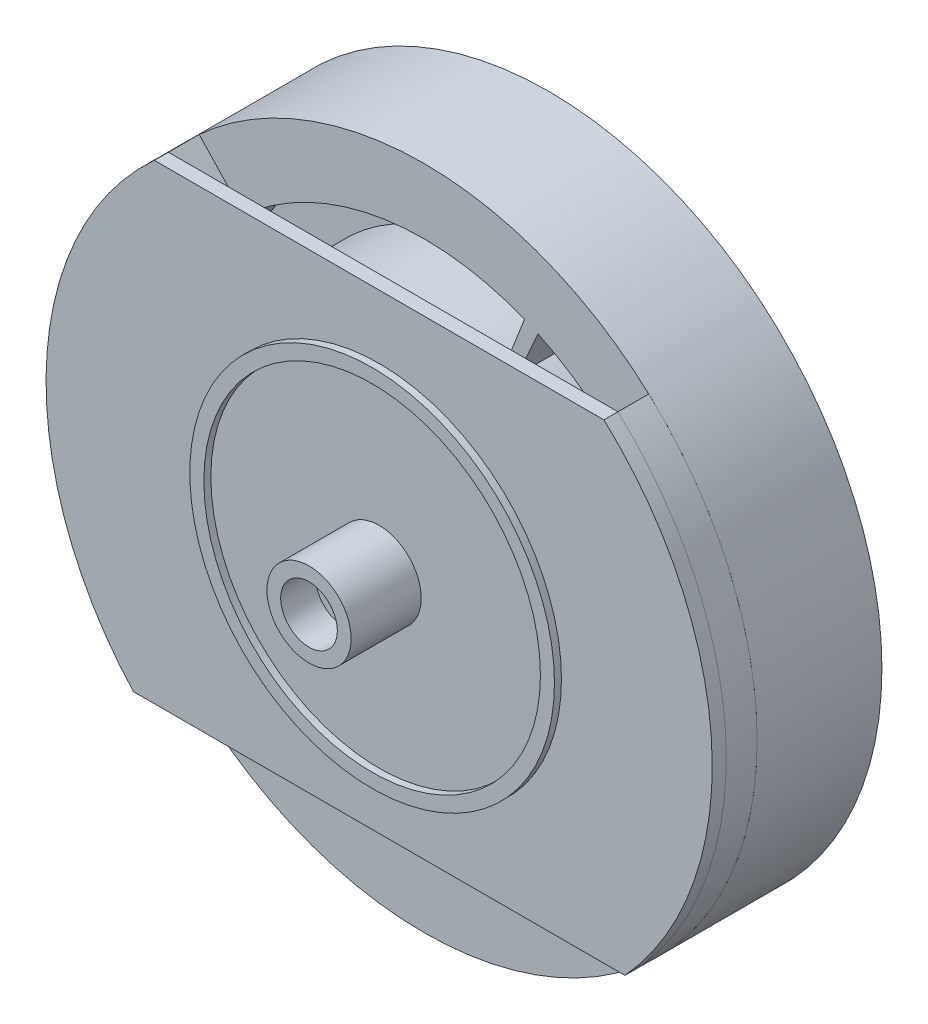
ISO-10303-21;
HEADER;
FILE_DESCRIPTION(('STEP AP214'),'2;1');
FILE_NAME('part.step','',(''),(''),'','','');
FILE_SCHEMA(('AUTOMOTIVE_DESIGN { 1 0 10303 214 1 1 1 1 }'));
ENDSEC;
DATA;
#1=APPLICATION_CONTEXT('core data for automotive mechanical design processes');
#2=APPLICATION_PROTOCOL_DEFINITION('international standard','automotive_design',2000,#1);
#3=PRODUCT_CONTEXT('',#1,'mechanical');
#4=PRODUCT('Part','Part','',(#3));
#5=PRODUCT_RELATED_PRODUCT_CATEGORY('part','',(#4));
#6=PRODUCT_DEFINITION_FORMATION('','',#4);
#7=PRODUCT_DEFINITION_CONTEXT('part definition',#1,'design');
#8=PRODUCT_DEFINITION('design','',#6,#7);
#9=PRODUCT_DEFINITION_SHAPE('','',#8);
#10=(LENGTH_UNIT() NAMED_UNIT(*) SI_UNIT(.MILLI.,.METRE.));
#11=(NAMED_UNIT(*) PLANE_ANGLE_UNIT() SI_UNIT($,.RADIAN.));
#12=(NAMED_UNIT(*) SI_UNIT($,.STERADIAN.) SOLID_ANGLE_UNIT());
#13=UNCERTAINTY_MEASURE_WITH_UNIT(LENGTH_MEASURE(1.E-05),#10,'distance_accuracy_value','');
#14=(GEOMETRIC_REPRESENTATION_CONTEXT(3) GLOBAL_UNCERTAINTY_ASSIGNED_CONTEXT((#13)) GLOBAL_UNIT_ASSIGNED_CONTEXT((#10,
#11,#12)) REPRESENTATION_CONTEXT('',''));
#15=CARTESIAN_POINT('',(0.,0.,0.));
#16=DIRECTION('',(0.,0.,1.));
#17=DIRECTION('',(1.,0.,0.));
#18=AXIS2_PLACEMENT_3D('',#15,#16,#17);
#19=CARTESIAN_POINT('',(-3.82843024285123,2.76033441316249,12.2448799994286));
#20=DIRECTION('',(0.,0.,1.));
#21=DIRECTION('',(1.,0.,0.));
#22=AXIS2_PLACEMENT_3D('',#19,#20,#21);
#23=PLANE('',#22);
#24=CARTESIAN_POINT('',(-3.82843024285123,2.76033441316249,12.2448799994286));
#25=DIRECTION('',(0.,0.,1.));
#26=DIRECTION('',(1.,0.,0.));
#27=AXIS2_PLACEMENT_3D('',#24,#25,#26);
#28=CIRCLE('',#27,23.75);
#29=CARTESIAN_POINT('',(-19.8553375945632,20.2874773845552,12.2448799994286));
#30=VERTEX_POINT('',#29);
#31=CARTESIAN_POINT('',(-21.355573214244,-13.2665729385494,12.2448799994286));
#32=VERTEX_POINT('',#31);
#33=EDGE_CURVE('E106',#30,#32,#28,.T.);
#34=ORIENTED_EDGE('',*,*,#33,.T.);
#35=DIRECTION('',(1.,0.,0.));
#36=VECTOR('',#35,1.);
#37=CARTESIAN_POINT('',(-21.355573214244,-13.2665729385494,12.2448799994286));
#38=LINE('',#37,#36);
#39=CARTESIAN_POINT('',(13.6987127285415,-13.2665729385494,12.2448799994286));
#40=VERTEX_POINT('',#39);
#41=EDGE_CURVE('E101',#32,#40,#38,.T.);
#42=ORIENTED_EDGE('',*,*,#41,.T.);
#43=CARTESIAN_POINT('',(-3.82843024285123,2.76033441316249,12.2448799994286));
#44=DIRECTION('',(0.,0.,1.));
#45=DIRECTION('',(-1.,0.,0.));
#46=AXIS2_PLACEMENT_3D('',#43,#44,#45);
#47=CIRCLE('',#46,23.75);
#48=CARTESIAN_POINT('',(12.1984771088607,20.2874773845552,12.2448799994286));
#49=VERTEX_POINT('',#48);
#50=EDGE_CURVE('E104',#40,#49,#47,.T.);
#51=ORIENTED_EDGE('',*,*,#50,.T.);
#52=DIRECTION('',(-1.,0.,0.));
#53=VECTOR('',#52,1.);
#54=CARTESIAN_POINT('',(-19.8553375945632,20.2874773845552,12.2448799994286));
#55=LINE('',#54,#53);
#56=EDGE_CURVE('E71',#49,#30,#55,.T.);
#57=ORIENTED_EDGE('',*,*,#56,.T.);
#58=EDGE_LOOP('',(#34,#42,#51,#57));
#59=FACE_BOUND('',#58,.T.);
#60=CARTESIAN_POINT('',(-3.82843024285123,2.76033441316249,12.2448799994286));
#61=DIRECTION('',(0.,0.,1.));
#62=DIRECTION('',(1.,0.,0.));
#63=AXIS2_PLACEMENT_3D('',#60,#61,#62);
#64=CIRCLE('',#63,13.);
#65=CARTESIAN_POINT('',(9.17156975714877,2.76033441316249,12.2448799994286));
#66=VERTEX_POINT('',#65);
#67=EDGE_CURVE('E141',#66,#66,#64,.T.);
#68=ORIENTED_EDGE('',*,*,#67,.F.);
#69=EDGE_LOOP('',(#68));
#70=FACE_BOUND('',#69,.T.);
#71=ADVANCED_FACE('F54',(#59,#70),#23,.T.);
#72=CARTESIAN_POINT('',(-3.82843024285123,2.76033441316249,12.2448799994286));
#73=DIRECTION('',(0.,0.,-1.));
#74=DIRECTION('',(-1.,0.,0.));
#75=AXIS2_PLACEMENT_3D('',#72,#73,#74);
#76=CYLINDRICAL_SURFACE('',#75,23.75);
#77=CARTESIAN_POINT('',(-3.82843024285123,2.76033441316249,11.2448799994286));
#78=DIRECTION('',(0.,0.,1.));
#79=DIRECTION('',(1.,0.,0.));
#80=AXIS2_PLACEMENT_3D('',#77,#78,#79);
#81=CIRCLE('',#80,23.75);
#82=CARTESIAN_POINT('',(-19.8553375945632,20.2874773845552,11.2448799994286));
#83=VERTEX_POINT('',#82);
#84=CARTESIAN_POINT('',(-21.355573214244,-13.2665729385494,11.2448799994286));
#85=VERTEX_POINT('',#84);
#86=EDGE_CURVE('E118',#83,#85,#81,.T.);
#87=ORIENTED_EDGE('',*,*,#86,.T.);
#88=DIRECTION('',(0.,0.,-1.));
#89=VECTOR('',#88,1.);
#90=CARTESIAN_POINT('',(-21.355573214244,-13.2665729385494,12.2448799994286));
#91=LINE('',#90,#89);
#92=EDGE_CURVE('E12',#32,#85,#91,.T.);
#93=ORIENTED_EDGE('',*,*,#92,.F.);
#94=ORIENTED_EDGE('',*,*,#33,.F.);
#95=DIRECTION('',(0.,0.,-1.));
#96=VECTOR('',#95,1.);
#97=CARTESIAN_POINT('',(-19.8553375945632,20.2874773845552,12.2448799994286));
#98=LINE('',#97,#96);
#99=EDGE_CURVE('E114',#30,#83,#98,.T.);
#100=ORIENTED_EDGE('',*,*,#99,.T.);
#101=EDGE_LOOP('',(#87,#93,#94,#100));
#102=FACE_BOUND('',#101,.T.);
#103=ADVANCED_FACE('F56',(#102),#76,.T.);
#104=CARTESIAN_POINT('',(-21.355573214244,-13.2665729385494,12.2448799994286));
#105=DIRECTION('',(0.,1.,0.));
#106=DIRECTION('',(0.,0.,1.));
#107=AXIS2_PLACEMENT_3D('',#104,#105,#106);
#108=PLANE('',#107);
#109=DIRECTION('',(1.,0.,0.));
#110=VECTOR('',#109,1.);
#111=CARTESIAN_POINT('',(-21.355573214244,-13.2665729385494,11.2448799994286));
#112=LINE('',#111,#110);
#113=CARTESIAN_POINT('',(13.6987127285415,-13.2665729385494,11.2448799994286));
#114=VERTEX_POINT('',#113);
#115=EDGE_CURVE('E110',#85,#114,#112,.T.);
#116=ORIENTED_EDGE('',*,*,#115,.T.);
#117=DIRECTION('',(0.,0.,-1.));
#118=VECTOR('',#117,1.);
#119=CARTESIAN_POINT('',(13.6987127285415,-13.2665729385494,12.2448799994286));
#120=LINE('',#119,#118);
#121=EDGE_CURVE('E63',#40,#114,#120,.T.);
#122=ORIENTED_EDGE('',*,*,#121,.F.);
#123=ORIENTED_EDGE('',*,*,#41,.F.);
#124=ORIENTED_EDGE('',*,*,#92,.T.);
#125=EDGE_LOOP('',(#116,#122,#123,#124));
#126=FACE_BOUND('',#125,.T.);
#127=ADVANCED_FACE('F109',(#126),#108,.F.);
#128=CARTESIAN_POINT('',(-3.82843024285123,2.76033441316249,12.2448799994286));
#129=DIRECTION('',(0.,0.,-1.));
#130=DIRECTION('',(-1.,0.,0.));
#131=AXIS2_PLACEMENT_3D('',#128,#129,#130);
#132=CYLINDRICAL_SURFACE('',#131,23.75);
#133=CARTESIAN_POINT('',(-3.82843024285123,2.76033441316249,11.2448799994286));
#134=DIRECTION('',(0.,0.,1.));
#135=DIRECTION('',(-1.,0.,0.));
#136=AXIS2_PLACEMENT_3D('',#133,#134,#135);
#137=CIRCLE('',#136,23.75);
#138=CARTESIAN_POINT('',(12.1984771088607,20.2874773845552,11.2448799994286));
#139=VERTEX_POINT('',#138);
#140=EDGE_CURVE('E88',#114,#139,#137,.T.);
#141=ORIENTED_EDGE('',*,*,#140,.T.);
#142=DIRECTION('',(0.,0.,-1.));
#143=VECTOR('',#142,1.);
#144=CARTESIAN_POINT('',(12.1984771088607,20.2874773845552,12.2448799994286));
#145=LINE('',#144,#143);
#146=EDGE_CURVE('E111',#49,#139,#145,.T.);
#147=ORIENTED_EDGE('',*,*,#146,.F.);
#148=ORIENTED_EDGE('',*,*,#50,.F.);
#149=ORIENTED_EDGE('',*,*,#121,.T.);
#150=EDGE_LOOP('',(#141,#147,#148,#149));
#151=FACE_BOUND('',#150,.T.);
#152=ADVANCED_FACE('F112',(#151),#132,.T.);
#153=CARTESIAN_POINT('',(-19.8553375945632,20.2874773845552,12.2448799994286));
#154=DIRECTION('',(0.,-1.,0.));
#155=DIRECTION('',(0.,0.,-1.));
#156=AXIS2_PLACEMENT_3D('',#153,#154,#155);
#157=PLANE('',#156);
#158=DIRECTION('',(-1.,0.,0.));
#159=VECTOR('',#158,1.);
#160=CARTESIAN_POINT('',(-19.8553375945632,20.2874773845552,11.2448799994286));
#161=LINE('',#160,#159);
#162=EDGE_CURVE('E94',#139,#83,#161,.T.);
#163=ORIENTED_EDGE('',*,*,#162,.T.);
#164=ORIENTED_EDGE('',*,*,#99,.F.);
#165=ORIENTED_EDGE('',*,*,#56,.F.);
#166=ORIENTED_EDGE('',*,*,#146,.T.);
#167=EDGE_LOOP('',(#163,#164,#165,#166));
#168=FACE_BOUND('',#167,.T.);
#169=ADVANCED_FACE('F126',(#168),#157,.F.);
#170=CARTESIAN_POINT('',(-3.82843024285123,2.76033441316249,11.2448799994286));
#171=DIRECTION('',(0.,0.,1.));
#172=DIRECTION('',(1.,0.,0.));
#173=AXIS2_PLACEMENT_3D('',#170,#171,#172);
#174=PLANE('',#173);
#175=ORIENTED_EDGE('',*,*,#86,.F.);
#176=ORIENTED_EDGE('',*,*,#162,.F.);
#177=ORIENTED_EDGE('',*,*,#140,.F.);
#178=ORIENTED_EDGE('',*,*,#115,.F.);
#179=EDGE_LOOP('',(#175,#176,#177,#178));
#180=FACE_BOUND('',#179,.T.);
#181=ADVANCED_FACE('F129',(#180),#174,.F.);
#182=CARTESIAN_POINT('',(-3.82843024285123,2.76033441316249,12.7448799994286));
#183=DIRECTION('',(0.,0.,-1.));
#184=DIRECTION('',(-1.,0.,0.));
#185=AXIS2_PLACEMENT_3D('',#182,#183,#184);
#186=CYLINDRICAL_SURFACE('',#185,13.);
#187=CARTESIAN_POINT('',(-3.82843024285123,2.76033441316249,12.7448799994286));
#188=DIRECTION('',(0.,0.,1.));
#189=DIRECTION('',(1.,0.,0.));
#190=AXIS2_PLACEMENT_3D('',#187,#188,#189);
#191=CIRCLE('',#190,13.);
#192=CARTESIAN_POINT('',(9.17156975714877,2.76033441316249,12.7448799994286));
#193=VERTEX_POINT('',#192);
#194=EDGE_CURVE('E135',#193,#193,#191,.T.);
#195=ORIENTED_EDGE('',*,*,#194,.F.);
#196=EDGE_LOOP('',(#195));
#197=FACE_BOUND('',#196,.T.);
#198=ORIENTED_EDGE('',*,*,#67,.T.);
#199=EDGE_LOOP('',(#198));
#200=FACE_BOUND('',#199,.T.);
#201=ADVANCED_FACE('F190',(#197,#200),#186,.T.);
#202=CARTESIAN_POINT('',(-3.82843024285123,2.76033441316249,12.7448799994286));
#203=DIRECTION('',(0.,0.,1.));
#204=DIRECTION('',(1.,0.,0.));
#205=AXIS2_PLACEMENT_3D('',#202,#203,#204);
#206=PLANE('',#205);
#207=CARTESIAN_POINT('',(-3.82843024285123,2.76033441316249,12.7448799994286));
#208=DIRECTION('',(0.,0.,1.));
#209=DIRECTION('',(1.,0.,0.));
#210=AXIS2_PLACEMENT_3D('',#207,#208,#209);
#211=CIRCLE('',#210,12.);
#212=CARTESIAN_POINT('',(8.17156975714877,2.76033441316249,12.7448799994286));
#213=VERTEX_POINT('',#212);
#214=EDGE_CURVE('E142',#213,#213,#211,.T.);
#215=ORIENTED_EDGE('',*,*,#214,.F.);
#216=EDGE_LOOP('',(#215));
#217=FACE_BOUND('',#216,.T.);
#218=ORIENTED_EDGE('',*,*,#194,.T.);
#219=EDGE_LOOP('',(#218));
#220=FACE_BOUND('',#219,.T.);
#221=ADVANCED_FACE('F184',(#217,#220),#206,.T.);
#222=CARTESIAN_POINT('',(-3.82843024285123,2.76033441316249,11.7448799994286));
#223=DIRECTION('',(0.,0.,1.));
#224=DIRECTION('',(1.,0.,0.));
#225=AXIS2_PLACEMENT_3D('',#222,#223,#224);
#226=CYLINDRICAL_SURFACE('',#225,12.);
#227=ORIENTED_EDGE('',*,*,#214,.T.);
#228=EDGE_LOOP('',(#227));
#229=FACE_BOUND('',#228,.T.);
#230=CARTESIAN_POINT('',(-3.82843024285123,2.76033441316249,12.2448799994286));
#231=DIRECTION('',(0.,0.,1.));
#232=DIRECTION('',(1.,0.,0.));
#233=AXIS2_PLACEMENT_3D('',#230,#231,#232);
#234=CIRCLE('',#233,12.);
#235=CARTESIAN_POINT('',(8.17156975714877,2.76033441316249,12.2448799994286));
#236=VERTEX_POINT('',#235);
#237=EDGE_CURVE('E138',#236,#236,#234,.T.);
#238=ORIENTED_EDGE('',*,*,#237,.F.);
#239=EDGE_LOOP('',(#238));
#240=FACE_BOUND('',#239,.T.);
#241=ADVANCED_FACE('F169',(#229,#240),#226,.F.);
#242=CARTESIAN_POINT('',(-3.82843024285123,2.76033441316249,17.2448799994286));
#243=DIRECTION('',(0.,0.,1.));
#244=DIRECTION('',(1.,0.,0.));
#245=AXIS2_PLACEMENT_3D('',#242,#243,#244);
#246=PLANE('',#245);
#247=CARTESIAN_POINT('',(-3.82843024285123,2.76033441316249,17.2448799994286));
#248=DIRECTION('',(0.,0.,1.));
#249=DIRECTION('',(1.,0.,0.));
#250=AXIS2_PLACEMENT_3D('',#247,#248,#249);
#251=CIRCLE('',#250,2.02);
#252=CARTESIAN_POINT('',(-1.80843024285123,2.76033441316249,17.2448799994286));
#253=VERTEX_POINT('',#252);
#254=EDGE_CURVE('E150',#253,#253,#251,.T.);
#255=ORIENTED_EDGE('',*,*,#254,.F.);
#256=EDGE_LOOP('',(#255));
#257=FACE_BOUND('',#256,.T.);
#258=CARTESIAN_POINT('',(-3.82843024285123,2.76033441316249,17.2448799994286));
#259=DIRECTION('',(0.,0.,1.));
#260=DIRECTION('',(1.,0.,0.));
#261=AXIS2_PLACEMENT_3D('',#258,#259,#260);
#262=CIRCLE('',#261,3.);
#263=CARTESIAN_POINT('',(-0.828430242851232,2.76033441316249,17.2448799994286));
#264=VERTEX_POINT('',#263);
#265=EDGE_CURVE('E121',#264,#264,#262,.T.);
#266=ORIENTED_EDGE('',*,*,#265,.T.);
#267=EDGE_LOOP('',(#266));
#268=FACE_BOUND('',#267,.T.);
#269=ADVANCED_FACE('F165',(#257,#268),#246,.T.);
#270=CARTESIAN_POINT('',(-3.82843024285123,2.76033441316249,17.2448799994286));
#271=DIRECTION('',(0.,0.,-1.));
#272=DIRECTION('',(-1.,0.,0.));
#273=AXIS2_PLACEMENT_3D('',#270,#271,#272);
#274=CYLINDRICAL_SURFACE('',#273,3.);
#275=ORIENTED_EDGE('',*,*,#265,.F.);
#276=EDGE_LOOP('',(#275));
#277=FACE_BOUND('',#276,.T.);
#278=CARTESIAN_POINT('',(-3.82843024285123,2.76033441316249,12.2448799994286));
#279=DIRECTION('',(0.,0.,1.));
#280=DIRECTION('',(1.,0.,0.));
#281=AXIS2_PLACEMENT_3D('',#278,#279,#280);
#282=CIRCLE('',#281,3.);
#283=CARTESIAN_POINT('',(-0.828430242851232,2.76033441316249,12.2448799994286));
#284=VERTEX_POINT('',#283);
#285=EDGE_CURVE('E132',#284,#284,#282,.T.);
#286=ORIENTED_EDGE('',*,*,#285,.T.);
#287=EDGE_LOOP('',(#286));
#288=FACE_BOUND('',#287,.T.);
#289=ADVANCED_FACE('F168',(#277,#288),#274,.T.);
#290=ORIENTED_EDGE('',*,*,#285,.F.);
#291=EDGE_LOOP('',(#290));
#292=FACE_BOUND('',#291,.T.);
#293=ORIENTED_EDGE('',*,*,#237,.T.);
#294=EDGE_LOOP('',(#293));
#295=FACE_BOUND('',#294,.T.);
#296=ADVANCED_FACE('F161',(#292,#295),#23,.T.);
#297=CARTESIAN_POINT('',(-3.82843024285123,2.76033441316249,14.7448799994286));
#298=DIRECTION('',(0.,0.,1.));
#299=DIRECTION('',(1.,0.,0.));
#300=AXIS2_PLACEMENT_3D('',#297,#298,#299);
#301=CYLINDRICAL_SURFACE('',#300,2.02);
#302=CARTESIAN_POINT('',(-3.82843024285123,2.76033441316249,14.7448799994286));
#303=DIRECTION('',(0.,0.,1.));
#304=DIRECTION('',(1.,0.,0.));
#305=AXIS2_PLACEMENT_3D('',#302,#303,#304);
#306=CIRCLE('',#305,2.02);
#307=CARTESIAN_POINT('',(-1.80843024285123,2.76033441316249,14.7448799994286));
#308=VERTEX_POINT('',#307);
#309=EDGE_CURVE('E149',#308,#308,#306,.T.);
#310=ORIENTED_EDGE('',*,*,#309,.F.);
#311=EDGE_LOOP('',(#310));
#312=FACE_BOUND('',#311,.T.);
#313=ORIENTED_EDGE('',*,*,#254,.T.);
#314=EDGE_LOOP('',(#313));
#315=FACE_BOUND('',#314,.T.);
#316=ADVANCED_FACE('F158',(#312,#315),#301,.F.);
#317=CARTESIAN_POINT('',(-3.82843024285123,2.76033441316249,14.7448799994286));
#318=DIRECTION('',(0.,0.,1.));
#319=DIRECTION('',(1.,0.,0.));
#320=AXIS2_PLACEMENT_3D('',#317,#318,#319);
#321=PLANE('',#320);
#322=ORIENTED_EDGE('',*,*,#309,.T.);
#323=EDGE_LOOP('',(#322));
#324=FACE_BOUND('',#323,.T.);
#325=ADVANCED_FACE('F156',(#324),#321,.T.);
#326=CLOSED_SHELL('',(#71,#103,#127,#152,#169,#181,#201,#221,#241,#269,#289,#296,#316,#325));
#327=MANIFOLD_SOLID_BREP('B2',#326);
#328=CARTESIAN_POINT('',(-3.82843024285123,2.76033441316249,9.04487999942864));
#329=DIRECTION('',(0.,0.,1.));
#330=DIRECTION('',(1.,0.,0.));
#331=AXIS2_PLACEMENT_3D('',#328,#329,#330);
#332=PLANE('',#331);
#333=CARTESIAN_POINT('',(-3.82843024285123,2.76033441316249,9.04487999942864));
#334=DIRECTION('',(0.,0.,-1.));
#335=DIRECTION('',(1.,0.,0.));
#336=AXIS2_PLACEMENT_3D('',#333,#334,#335);
#337=CIRCLE('',#336,19.1);
#338=CARTESIAN_POINT('',(-17.9579810626889,-10.0913500534599,9.04487999942864));
#339=VERTEX_POINT('',#338);
#340=CARTESIAN_POINT('',(-16.6801147094736,16.8898852330002,9.04487999942864));
#341=VERTEX_POINT('',#340);
#342=EDGE_CURVE('E52',#339,#341,#337,.T.);
#343=ORIENTED_EDGE('',*,*,#342,.F.);
#344=DIRECTION('',(0.730611377314205,0.682793537856825,0.));
#345=VECTOR('',#344,1.);
#346=CARTESIAN_POINT('',(-21.355573214244,-13.2665729385494,9.04487999942864));
#347=LINE('',#346,#345);
#348=CARTESIAN_POINT('',(-21.355573214244,-13.2665729385494,9.04487999942864));
#349=VERTEX_POINT('',#348);
#350=EDGE_CURVE('E398',#349,#339,#347,.T.);
#351=ORIENTED_EDGE('',*,*,#350,.F.);
#352=CARTESIAN_POINT('',(-3.82843024285123,2.76033441316249,9.04487999942864));
#353=DIRECTION('',(0.,0.,1.));
#354=DIRECTION('',(1.,0.,0.));
#355=AXIS2_PLACEMENT_3D('',#352,#353,#354);
#356=CIRCLE('',#355,23.75);
#357=CARTESIAN_POINT('',(-19.8553375945632,20.2874773845552,9.04487999942864));
#358=VERTEX_POINT('',#357);
#359=EDGE_CURVE('E401',#358,#349,#356,.T.);
#360=ORIENTED_EDGE('',*,*,#359,.F.);
#361=DIRECTION('',(-0.682793537856825,0.730611377314205,0.));
#362=VECTOR('',#361,1.);
#363=CARTESIAN_POINT('',(-16.6801147094736,16.8898852330002,9.04487999942864));
#364=LINE('',#363,#362);
#365=EDGE_CURVE('E344',#341,#358,#364,.T.);
#366=ORIENTED_EDGE('',*,*,#365,.F.);
#367=EDGE_LOOP('',(#343,#351,#360,#366));
#368=FACE_BOUND('',#367,.T.);
#369=ADVANCED_FACE('F335',(#368),#332,.F.);
#370=CARTESIAN_POINT('',(-21.355573214244,-13.2665729385494,47.2244431281084));
#371=DIRECTION('',(-0.682793537856825,0.730611377314205,0.));
#372=DIRECTION('',(-0.730611377314205,-0.682793537856825,0.));
#373=AXIS2_PLACEMENT_3D('',#370,#371,#372);
#374=PLANE('',#373);
#375=DIRECTION('',(0.,0.,-1.));
#376=VECTOR('',#375,1.);
#377=CARTESIAN_POINT('',(-17.9579810626889,-10.0913500534599,47.2244431281084));
#378=LINE('',#377,#376);
#379=CARTESIAN_POINT('',(-17.9579810626889,-10.0913500534599,11.2448799994286));
#380=VERTEX_POINT('',#379);
#381=EDGE_CURVE('E396',#380,#339,#378,.T.);
#382=ORIENTED_EDGE('',*,*,#381,.F.);
#383=DIRECTION('',(-0.730611377314205,-0.682793537856825,0.));
#384=VECTOR('',#383,1.);
#385=CARTESIAN_POINT('',(-21.355573214244,-13.2665729385494,11.2448799994286));
#386=LINE('',#385,#384);
#387=CARTESIAN_POINT('',(-21.355573214244,-13.2665729385494,11.2448799994286));
#388=VERTEX_POINT('',#387);
#389=EDGE_CURVE('E389',#380,#388,#386,.T.);
#390=ORIENTED_EDGE('',*,*,#389,.T.);
#391=DIRECTION('',(0.,0.,-1.));
#392=VECTOR('',#391,1.);
#393=CARTESIAN_POINT('',(-21.355573214244,-13.2665729385494,47.2244431281084));
#394=LINE('',#393,#392);
#395=EDGE_CURVE('E385',#388,#349,#394,.T.);
#396=ORIENTED_EDGE('',*,*,#395,.T.);
#397=ORIENTED_EDGE('',*,*,#350,.T.);
#398=EDGE_LOOP('',(#382,#390,#396,#397));
#399=FACE_BOUND('',#398,.T.);
#400=ADVANCED_FACE('F406',(#399),#374,.F.);
#401=CARTESIAN_POINT('',(-3.82843024285123,2.76033441316249,47.2244431281084));
#402=DIRECTION('',(0.,0.,-1.));
#403=DIRECTION('',(-1.,0.,0.));
#404=AXIS2_PLACEMENT_3D('',#401,#402,#403);
#405=CYLINDRICAL_SURFACE('',#404,23.75);
#406=ORIENTED_EDGE('',*,*,#395,.F.);
#407=CARTESIAN_POINT('',(-3.82843024285123,2.76033441316249,11.2448799994286));
#408=DIRECTION('',(0.,0.,-1.));
#409=DIRECTION('',(-1.,0.,0.));
#410=AXIS2_PLACEMENT_3D('',#407,#408,#409);
#411=CIRCLE('',#410,23.75);
#412=CARTESIAN_POINT('',(-19.8553375945632,20.2874773845552,11.2448799994286));
#413=VERTEX_POINT('',#412);
#414=EDGE_CURVE('E339',#388,#413,#411,.T.);
#415=ORIENTED_EDGE('',*,*,#414,.T.);
#416=DIRECTION('',(0.,0.,-1.));
#417=VECTOR('',#416,1.);
#418=CARTESIAN_POINT('',(-19.8553375945632,20.2874773845552,47.2244431281084));
#419=LINE('',#418,#417);
#420=EDGE_CURVE('E360',#413,#358,#419,.T.);
#421=ORIENTED_EDGE('',*,*,#420,.T.);
#422=ORIENTED_EDGE('',*,*,#359,.T.);
#423=EDGE_LOOP('',(#406,#415,#421,#422));
#424=FACE_BOUND('',#423,.T.);
#425=ADVANCED_FACE('F387',(#424),#405,.T.);
#426=CARTESIAN_POINT('',(-16.6801147094736,16.8898852330002,47.2244431281084));
#427=DIRECTION('',(-0.730611377314205,-0.682793537856825,0.));
#428=DIRECTION('',(0.682793537856825,-0.730611377314205,0.));
#429=AXIS2_PLACEMENT_3D('',#426,#427,#428);
#430=PLANE('',#429);
#431=ORIENTED_EDGE('',*,*,#420,.F.);
#432=DIRECTION('',(0.682793537856825,-0.730611377314205,0.));
#433=VECTOR('',#432,1.);
#434=CARTESIAN_POINT('',(-16.6801147094736,16.8898852330002,11.2448799994286));
#435=LINE('',#434,#433);
#436=CARTESIAN_POINT('',(-16.6801147094736,16.8898852330002,11.2448799994286));
#437=VERTEX_POINT('',#436);
#438=EDGE_CURVE('E379',#413,#437,#435,.T.);
#439=ORIENTED_EDGE('',*,*,#438,.T.);
#440=DIRECTION('',(0.,0.,-1.));
#441=VECTOR('',#440,1.);
#442=CARTESIAN_POINT('',(-16.6801147094736,16.8898852330002,47.2244431281084));
#443=LINE('',#442,#441);
#444=EDGE_CURVE('E352',#437,#341,#443,.T.);
#445=ORIENTED_EDGE('',*,*,#444,.T.);
#446=ORIENTED_EDGE('',*,*,#365,.T.);
#447=EDGE_LOOP('',(#431,#439,#445,#446));
#448=FACE_BOUND('',#447,.T.);
#449=ADVANCED_FACE('F383',(#448),#430,.F.);
#450=CARTESIAN_POINT('',(-3.82843024285123,2.76033441316249,47.2244431281084));
#451=DIRECTION('',(0.,0.,-1.));
#452=DIRECTION('',(-1.,0.,0.));
#453=AXIS2_PLACEMENT_3D('',#450,#451,#452);
#454=CYLINDRICAL_SURFACE('',#453,19.1);
#455=ORIENTED_EDGE('',*,*,#444,.F.);
#456=CARTESIAN_POINT('',(-3.82843024285123,2.76033441316249,11.2448799994286));
#457=DIRECTION('',(0.,0.,-1.));
#458=DIRECTION('',(-1.,0.,0.));
#459=AXIS2_PLACEMENT_3D('',#456,#457,#458);
#460=CIRCLE('',#459,19.1);
#461=EDGE_CURVE('E382',#437,#380,#460,.F.);
#462=ORIENTED_EDGE('',*,*,#461,.T.);
#463=ORIENTED_EDGE('',*,*,#381,.T.);
#464=ORIENTED_EDGE('',*,*,#342,.T.);
#465=EDGE_LOOP('',(#455,#462,#463,#464));
#466=FACE_BOUND('',#465,.T.);
#467=ADVANCED_FACE('F405',(#466),#454,.F.);
#468=CARTESIAN_POINT('',(-3.82843024285123,2.76033441316249,11.2448799994286));
#469=DIRECTION('',(0.,0.,-1.));
#470=DIRECTION('',(-1.,0.,0.));
#471=AXIS2_PLACEMENT_3D('',#468,#469,#470);
#472=PLANE('',#471);
#473=ORIENTED_EDGE('',*,*,#438,.F.);
#474=ORIENTED_EDGE('',*,*,#414,.F.);
#475=ORIENTED_EDGE('',*,*,#389,.F.);
#476=ORIENTED_EDGE('',*,*,#461,.F.);
#477=EDGE_LOOP('',(#473,#474,#475,#476));
#478=FACE_BOUND('',#477,.T.);
#479=ADVANCED_FACE('F337',(#478),#472,.F.);
#480=CLOSED_SHELL('',(#369,#400,#425,#449,#467,#479));
#481=MANIFOLD_SOLID_BREP('B6',#480);
#482=CARTESIAN_POINT('',(-3.82843024285123,2.76033441316249,9.04487999942864));
#483=DIRECTION('',(0.,0.,-1.));
#484=DIRECTION('',(-1.,0.,0.));
#485=AXIS2_PLACEMENT_3D('',#482,#483,#484);
#486=PLANE('',#485);
#487=CARTESIAN_POINT('',(-3.82843024285123,2.76033441316249,9.04487999942864));
#488=DIRECTION('',(0.,0.,-1.));
#489=DIRECTION('',(-1.,0.,0.));
#490=AXIS2_PLACEMENT_3D('',#487,#488,#489);
#491=CIRCLE('',#490,19.1);
#492=CARTESIAN_POINT('',(9.02325422377115,16.8898852330002,9.04487999942864));
#493=VERTEX_POINT('',#492);
#494=CARTESIAN_POINT('',(10.3011205769865,-10.0913500534599,9.04487999942864));
#495=VERTEX_POINT('',#494);
#496=EDGE_CURVE('E531',#493,#495,#491,.T.);
#497=ORIENTED_EDGE('',*,*,#496,.F.);
#498=DIRECTION('',(-0.682793537856827,-0.730611377314204,0.));
#499=VECTOR('',#498,1.);
#500=CARTESIAN_POINT('',(9.02325422377115,16.8898852330002,9.04487999942864));
#501=LINE('',#500,#499);
#502=CARTESIAN_POINT('',(12.1984771088607,20.2874773845552,9.04487999942864));
#503=VERTEX_POINT('',#502);
#504=EDGE_CURVE('E542',#503,#493,#501,.T.);
#505=ORIENTED_EDGE('',*,*,#504,.F.);
#506=CARTESIAN_POINT('',(-3.82843024285123,2.76033441316249,9.04487999942864));
#507=DIRECTION('',(0.,0.,1.));
#508=DIRECTION('',(1.,0.,0.));
#509=AXIS2_PLACEMENT_3D('',#506,#507,#508);
#510=CIRCLE('',#509,23.75);
#511=CARTESIAN_POINT('',(13.6987127285415,-13.2665729385494,9.04487999942864));
#512=VERTEX_POINT('',#511);
#513=EDGE_CURVE('E533',#512,#503,#510,.T.);
#514=ORIENTED_EDGE('',*,*,#513,.F.);
#515=DIRECTION('',(0.730611377314204,-0.682793537856827,0.));
#516=VECTOR('',#515,1.);
#517=CARTESIAN_POINT('',(13.6987127285415,-13.2665729385494,9.04487999942864));
#518=LINE('',#517,#516);
#519=EDGE_CURVE('E523',#495,#512,#518,.T.);
#520=ORIENTED_EDGE('',*,*,#519,.F.);
#521=EDGE_LOOP('',(#497,#505,#514,#520));
#522=FACE_BOUND('',#521,.T.);
#523=ADVANCED_FACE('F481',(#522),#486,.T.);
#524=CARTESIAN_POINT('',(9.02325422377115,16.8898852330002,47.2244431281084));
#525=DIRECTION('',(0.730611377314204,-0.682793537856827,0.));
#526=DIRECTION('',(0.682793537856827,0.730611377314204,0.));
#527=AXIS2_PLACEMENT_3D('',#524,#525,#526);
#528=PLANE('',#527);
#529=DIRECTION('',(0.,0.,-1.));
#530=VECTOR('',#529,1.);
#531=CARTESIAN_POINT('',(9.02325422377115,16.8898852330002,47.2244431281084));
#532=LINE('',#531,#530);
#533=CARTESIAN_POINT('',(9.02325422377115,16.8898852330002,11.2448799994286));
#534=VERTEX_POINT('',#533);
#535=EDGE_CURVE('E536',#534,#493,#532,.T.);
#536=ORIENTED_EDGE('',*,*,#535,.F.);
#537=DIRECTION('',(0.682793537856827,0.730611377314204,0.));
#538=VECTOR('',#537,1.);
#539=CARTESIAN_POINT('',(9.02325422377115,16.8898852330002,11.2448799994286));
#540=LINE('',#539,#538);
#541=CARTESIAN_POINT('',(12.1984771088607,20.2874773845552,11.2448799994286));
#542=VERTEX_POINT('',#541);
#543=EDGE_CURVE('E485',#534,#542,#540,.T.);
#544=ORIENTED_EDGE('',*,*,#543,.T.);
#545=DIRECTION('',(0.,0.,-1.));
#546=VECTOR('',#545,1.);
#547=CARTESIAN_POINT('',(12.1984771088607,20.2874773845552,47.2244431281084));
#548=LINE('',#547,#546);
#549=EDGE_CURVE('E545',#542,#503,#548,.T.);
#550=ORIENTED_EDGE('',*,*,#549,.T.);
#551=ORIENTED_EDGE('',*,*,#504,.T.);
#552=EDGE_LOOP('',(#536,#544,#550,#551));
#553=FACE_BOUND('',#552,.T.);
#554=ADVANCED_FACE('F554',(#553),#528,.F.);
#555=CARTESIAN_POINT('',(-3.82843024285123,2.76033441316249,47.2244431281084));
#556=DIRECTION('',(0.,0.,-1.));
#557=DIRECTION('',(-1.,0.,0.));
#558=AXIS2_PLACEMENT_3D('',#555,#556,#557);
#559=CYLINDRICAL_SURFACE('',#558,23.75);
#560=ORIENTED_EDGE('',*,*,#549,.F.);
#561=CARTESIAN_POINT('',(-3.82843024285123,2.76033441316249,11.2448799994286));
#562=DIRECTION('',(0.,0.,-1.));
#563=DIRECTION('',(-1.,0.,0.));
#564=AXIS2_PLACEMENT_3D('',#561,#562,#563);
#565=CIRCLE('',#564,23.75);
#566=CARTESIAN_POINT('',(13.6987127285415,-13.2665729385494,11.2448799994286));
#567=VERTEX_POINT('',#566);
#568=EDGE_CURVE('E551',#542,#567,#565,.T.);
#569=ORIENTED_EDGE('',*,*,#568,.T.);
#570=DIRECTION('',(0.,0.,-1.));
#571=VECTOR('',#570,1.);
#572=CARTESIAN_POINT('',(13.6987127285415,-13.2665729385494,47.2244431281084));
#573=LINE('',#572,#571);
#574=EDGE_CURVE('E527',#567,#512,#573,.T.);
#575=ORIENTED_EDGE('',*,*,#574,.T.);
#576=ORIENTED_EDGE('',*,*,#513,.T.);
#577=EDGE_LOOP('',(#560,#569,#575,#576));
#578=FACE_BOUND('',#577,.T.);
#579=ADVANCED_FACE('F550',(#578),#559,.T.);
#580=CARTESIAN_POINT('',(13.6987127285415,-13.2665729385494,47.2244431281084));
#581=DIRECTION('',(0.682793537856827,0.730611377314204,0.));
#582=DIRECTION('',(-0.730611377314204,0.682793537856827,0.));
#583=AXIS2_PLACEMENT_3D('',#580,#581,#582);
#584=PLANE('',#583);
#585=ORIENTED_EDGE('',*,*,#574,.F.);
#586=DIRECTION('',(-0.730611377314204,0.682793537856827,0.));
#587=VECTOR('',#586,1.);
#588=CARTESIAN_POINT('',(13.6987127285415,-13.2665729385494,11.2448799994286));
#589=LINE('',#588,#587);
#590=CARTESIAN_POINT('',(10.3011205769865,-10.0913500534599,11.2448799994286));
#591=VERTEX_POINT('',#590);
#592=EDGE_CURVE('E490',#567,#591,#589,.T.);
#593=ORIENTED_EDGE('',*,*,#592,.T.);
#594=DIRECTION('',(0.,0.,-1.));
#595=VECTOR('',#594,1.);
#596=CARTESIAN_POINT('',(10.3011205769865,-10.0913500534599,47.2244431281084));
#597=LINE('',#596,#595);
#598=EDGE_CURVE('E520',#591,#495,#597,.T.);
#599=ORIENTED_EDGE('',*,*,#598,.T.);
#600=ORIENTED_EDGE('',*,*,#519,.T.);
#601=EDGE_LOOP('',(#585,#593,#599,#600));
#602=FACE_BOUND('',#601,.T.);
#603=ADVANCED_FACE('F522',(#602),#584,.F.);
#604=CARTESIAN_POINT('',(-3.82843024285123,2.76033441316249,47.2244431281084));
#605=DIRECTION('',(0.,0.,-1.));
#606=DIRECTION('',(-1.,0.,0.));
#607=AXIS2_PLACEMENT_3D('',#604,#605,#606);
#608=CYLINDRICAL_SURFACE('',#607,19.1);
#609=ORIENTED_EDGE('',*,*,#598,.F.);
#610=CARTESIAN_POINT('',(-3.82843024285123,2.76033441316249,11.2448799994286));
#611=DIRECTION('',(0.,0.,-1.));
#612=DIRECTION('',(-1.,0.,0.));
#613=AXIS2_PLACEMENT_3D('',#610,#611,#612);
#614=CIRCLE('',#613,19.1);
#615=EDGE_CURVE('E333',#591,#534,#614,.F.);
#616=ORIENTED_EDGE('',*,*,#615,.T.);
#617=ORIENTED_EDGE('',*,*,#535,.T.);
#618=ORIENTED_EDGE('',*,*,#496,.T.);
#619=EDGE_LOOP('',(#609,#616,#617,#618));
#620=FACE_BOUND('',#619,.T.);
#621=ADVANCED_FACE('F483',(#620),#608,.F.);
#622=CARTESIAN_POINT('',(-3.82843024285123,2.76033441316249,11.2448799994286));
#623=DIRECTION('',(0.,0.,-1.));
#624=DIRECTION('',(-1.,0.,0.));
#625=AXIS2_PLACEMENT_3D('',#622,#623,#624);
#626=PLANE('',#625);
#627=ORIENTED_EDGE('',*,*,#592,.F.);
#628=ORIENTED_EDGE('',*,*,#568,.F.);
#629=ORIENTED_EDGE('',*,*,#543,.F.);
#630=ORIENTED_EDGE('',*,*,#615,.F.);
#631=EDGE_LOOP('',(#627,#628,#629,#630));
#632=FACE_BOUND('',#631,.T.);
#633=ADVANCED_FACE('F568',(#632),#626,.F.);
#634=CLOSED_SHELL('',(#523,#554,#579,#603,#621,#633));
#635=MANIFOLD_SOLID_BREP('B46',#634);
#636=CARTESIAN_POINT('',(-3.82843024285123,2.76033441316249,9.04487999942864));
#637=DIRECTION('',(0.,0.,1.));
#638=DIRECTION('',(1.,0.,0.));
#639=AXIS2_PLACEMENT_3D('',#636,#637,#638);
#640=PLANE('',#639);
#641=CARTESIAN_POINT('',(-3.82843024285123,2.76033441316249,9.04487999942864));
#642=DIRECTION('',(0.,0.,1.));
#643=DIRECTION('',(1.,0.,0.));
#644=AXIS2_PLACEMENT_3D('',#641,#642,#643);
#645=CIRCLE('',#644,23.75);
#646=CARTESIAN_POINT('',(19.9215697571488,2.76033441316249,9.04487999942864));
#647=VERTEX_POINT('',#646);
#648=EDGE_CURVE('E627',#647,#647,#645,.T.);
#649=ORIENTED_EDGE('',*,*,#648,.T.);
#650=EDGE_LOOP('',(#649));
#651=FACE_BOUND('',#650,.T.);
#652=CARTESIAN_POINT('',(-3.82843024285123,2.76033441316249,9.04487999942864));
#653=DIRECTION('',(0.,0.,-1.));
#654=DIRECTION('',(-1.,0.,0.));
#655=AXIS2_PLACEMENT_3D('',#652,#653,#654);
#656=CIRCLE('',#655,19.1);
#657=CARTESIAN_POINT('',(4.30004956856877,20.0443679688849,9.04487999942864));
#658=VERTEX_POINT('',#657);
#659=CARTESIAN_POINT('',(3.3391642421517,20.4644466275198,9.04487999942864));
#660=VERTEX_POINT('',#659);
#661=EDGE_CURVE('E687',#658,#660,#656,.T.);
#662=ORIENTED_EDGE('',*,*,#661,.T.);
#663=DIRECTION('',(-0.366325854408053,-0.930486629883638,0.));
#664=VECTOR('',#663,1.);
#665=CARTESIAN_POINT('',(2.02031585385546,17.1145034624756,9.04487999942864));
#666=LINE('',#665,#664);
#667=CARTESIAN_POINT('',(2.02031585385546,17.1145034624756,9.04487999942864));
#668=VERTEX_POINT('',#667);
#669=EDGE_CURVE('E690',#660,#668,#666,.T.);
#670=ORIENTED_EDGE('',*,*,#669,.T.);
#671=CARTESIAN_POINT('',(-3.82843024285123,2.76033441316249,9.04487999942864));
#672=DIRECTION('',(0.,0.,1.));
#673=DIRECTION('',(1.,0.,0.));
#674=AXIS2_PLACEMENT_3D('',#671,#672,#673);
#675=CIRCLE('',#674,15.5);
#676=CARTESIAN_POINT('',(2.81993042842189,16.7620950304802,9.04487999942864));
#677=VERTEX_POINT('',#676);
#678=EDGE_CURVE('E479',#677,#668,#675,.T.);
#679=ORIENTED_EDGE('',*,*,#678,.F.);
#680=DIRECTION('',(0.411079689049984,0.911599412708547,0.));
#681=VECTOR('',#680,1.);
#682=CARTESIAN_POINT('',(2.81993042842189,16.7620950304802,9.04487999942864));
#683=LINE('',#682,#681);
#684=EDGE_CURVE('E635',#677,#658,#683,.T.);
#685=ORIENTED_EDGE('',*,*,#684,.T.);
#686=EDGE_LOOP('',(#662,#670,#679,#685));
#687=FACE_BOUND('',#686,.T.);
#688=ADVANCED_FACE('F618',(#651,#687),#640,.T.);
#689=CARTESIAN_POINT('',(-3.82843024285123,2.76033441316249,9.04487999942864));
#690=DIRECTION('',(0.,0.,-1.));
#691=DIRECTION('',(-1.,0.,0.));
#692=AXIS2_PLACEMENT_3D('',#689,#690,#691);
#693=CYLINDRICAL_SURFACE('',#692,23.75);
#694=ORIENTED_EDGE('',*,*,#648,.F.);
#695=EDGE_LOOP('',(#694));
#696=FACE_BOUND('',#695,.T.);
#697=CARTESIAN_POINT('',(-3.82843024285123,2.76033441316249,0.144879999428638));
#698=DIRECTION('',(0.,0.,1.));
#699=DIRECTION('',(1.,0.,0.));
#700=AXIS2_PLACEMENT_3D('',#697,#698,#699);
#701=CIRCLE('',#700,23.75);
#702=CARTESIAN_POINT('',(19.9215697571488,2.76033441316249,0.144879999428638));
#703=VERTEX_POINT('',#702);
#704=EDGE_CURVE('E622',#703,#703,#701,.T.);
#705=ORIENTED_EDGE('',*,*,#704,.T.);
#706=EDGE_LOOP('',(#705));
#707=FACE_BOUND('',#706,.T.);
#708=ADVANCED_FACE('F620',(#696,#707),#693,.T.);
#709=CARTESIAN_POINT('',(-3.82843024285123,2.76033441316249,0.144879999428638));
#710=DIRECTION('',(0.,0.,1.));
#711=DIRECTION('',(1.,0.,0.));
#712=AXIS2_PLACEMENT_3D('',#709,#710,#711);
#713=PLANE('',#712);
#714=CARTESIAN_POINT('',(-3.82843024285123,2.76033441316249,0.144879999428638));
#715=DIRECTION('',(0.,0.,1.));
#716=DIRECTION('',(1.,0.,0.));
#717=AXIS2_PLACEMENT_3D('',#714,#715,#716);
#718=CIRCLE('',#717,4.08);
#719=CARTESIAN_POINT('',(0.251569757148767,2.76033441316249,0.144879999428638));
#720=VERTEX_POINT('',#719);
#721=EDGE_CURVE('E691',#720,#720,#718,.F.);
#722=ORIENTED_EDGE('',*,*,#721,.F.);
#723=EDGE_LOOP('',(#722));
#724=FACE_BOUND('',#723,.T.);
#725=ORIENTED_EDGE('',*,*,#704,.F.);
#726=EDGE_LOOP('',(#725));
#727=FACE_BOUND('',#726,.T.);
#728=ADVANCED_FACE('F706',(#724,#727),#713,.F.);
#729=CARTESIAN_POINT('',(-3.82843024285123,2.76033441316249,10.5448799994286));
#730=DIRECTION('',(0.,0.,-1.));
#731=DIRECTION('',(-1.,0.,0.));
#732=AXIS2_PLACEMENT_3D('',#729,#730,#731);
#733=CYLINDRICAL_SURFACE('',#732,15.5);
#734=ORIENTED_EDGE('',*,*,#678,.T.);
#735=DIRECTION('',(0.,0.,1.));
#736=VECTOR('',#735,1.);
#737=CARTESIAN_POINT('',(2.02031585385546,17.1145034624756,3.64487999942864));
#738=LINE('',#737,#736);
#739=CARTESIAN_POINT('',(2.02031585385546,17.1145034624756,3.64487999942864));
#740=VERTEX_POINT('',#739);
#741=EDGE_CURVE('E669',#740,#668,#738,.T.);
#742=ORIENTED_EDGE('',*,*,#741,.F.);
#743=CARTESIAN_POINT('',(-3.82843024285123,2.76033441316249,3.64487999942864));
#744=DIRECTION('',(0.,0.,1.));
#745=DIRECTION('',(1.,0.,0.));
#746=AXIS2_PLACEMENT_3D('',#743,#744,#745);
#747=CIRCLE('',#746,15.5);
#748=CARTESIAN_POINT('',(2.81993042842189,16.7620950304802,3.64487999942864));
#749=VERTEX_POINT('',#748);
#750=EDGE_CURVE('E673',#740,#749,#747,.T.);
#751=ORIENTED_EDGE('',*,*,#750,.T.);
#752=DIRECTION('',(0.,0.,1.));
#753=VECTOR('',#752,1.);
#754=CARTESIAN_POINT('',(2.81993042842189,16.7620950304802,3.64487999942864));
#755=LINE('',#754,#753);
#756=EDGE_CURVE('E680',#749,#677,#755,.T.);
#757=ORIENTED_EDGE('',*,*,#756,.T.);
#758=EDGE_LOOP('',(#734,#742,#751,#757));
#759=FACE_BOUND('',#758,.T.);
#760=CARTESIAN_POINT('',(-3.82843024285123,2.76033441316249,10.5448799994286));
#761=DIRECTION('',(0.,0.,-1.));
#762=DIRECTION('',(-1.,0.,0.));
#763=AXIS2_PLACEMENT_3D('',#760,#761,#762);
#764=CIRCLE('',#763,15.5);
#765=CARTESIAN_POINT('',(-19.3284302428512,2.76033441316249,10.5448799994286));
#766=VERTEX_POINT('',#765);
#767=EDGE_CURVE('E697',#766,#766,#764,.T.);
#768=ORIENTED_EDGE('',*,*,#767,.T.);
#769=EDGE_LOOP('',(#768));
#770=FACE_BOUND('',#769,.T.);
#771=ADVANCED_FACE('F677',(#759,#770),#733,.T.);
#772=CARTESIAN_POINT('',(-3.82843024285123,2.76033441316249,10.5448799994286));
#773=DIRECTION('',(0.,0.,-1.));
#774=DIRECTION('',(-1.,0.,0.));
#775=AXIS2_PLACEMENT_3D('',#772,#773,#774);
#776=PLANE('',#775);
#777=CARTESIAN_POINT('',(-3.82843024285123,2.76033441316249,10.5448799994286));
#778=DIRECTION('',(0.,0.,1.));
#779=DIRECTION('',(1.,0.,0.));
#780=AXIS2_PLACEMENT_3D('',#777,#778,#779);
#781=CIRCLE('',#780,4.08);
#782=CARTESIAN_POINT('',(0.251569757148767,2.76033441316249,10.5448799994286));
#783=VERTEX_POINT('',#782);
#784=EDGE_CURVE('E745',#783,#783,#781,.T.);
#785=ORIENTED_EDGE('',*,*,#784,.F.);
#786=EDGE_LOOP('',(#785));
#787=FACE_BOUND('',#786,.T.);
#788=ORIENTED_EDGE('',*,*,#767,.F.);
#789=EDGE_LOOP('',(#788));
#790=FACE_BOUND('',#789,.T.);
#791=ADVANCED_FACE('F713',(#787,#790),#776,.F.);
#792=CARTESIAN_POINT('',(-3.82843024285123,2.76033441316249,3.64487999942864));
#793=DIRECTION('',(0.,0.,1.));
#794=DIRECTION('',(1.,0.,0.));
#795=AXIS2_PLACEMENT_3D('',#792,#793,#794);
#796=CYLINDRICAL_SURFACE('',#795,19.1);
#797=ORIENTED_EDGE('',*,*,#661,.F.);
#798=DIRECTION('',(0.,0.,1.));
#799=VECTOR('',#798,1.);
#800=CARTESIAN_POINT('',(4.30004956856877,20.0443679688849,3.64487999942864));
#801=LINE('',#800,#799);
#802=CARTESIAN_POINT('',(4.30004956856877,20.0443679688849,3.64487999942864));
#803=VERTEX_POINT('',#802);
#804=EDGE_CURVE('E655',#803,#658,#801,.T.);
#805=ORIENTED_EDGE('',*,*,#804,.F.);
#806=CARTESIAN_POINT('',(-3.82843024285123,2.76033441316249,3.64487999942864));
#807=DIRECTION('',(0.,0.,-1.));
#808=DIRECTION('',(-1.,0.,0.));
#809=AXIS2_PLACEMENT_3D('',#806,#807,#808);
#810=CIRCLE('',#809,19.1);
#811=CARTESIAN_POINT('',(3.3391642421517,20.4644466275198,3.64487999942864));
#812=VERTEX_POINT('',#811);
#813=EDGE_CURVE('E674',#803,#812,#810,.T.);
#814=ORIENTED_EDGE('',*,*,#813,.T.);
#815=DIRECTION('',(0.,0.,1.));
#816=VECTOR('',#815,1.);
#817=CARTESIAN_POINT('',(3.3391642421517,20.4644466275198,3.64487999942864));
#818=LINE('',#817,#816);
#819=EDGE_CURVE('E672',#812,#660,#818,.T.);
#820=ORIENTED_EDGE('',*,*,#819,.T.);
#821=EDGE_LOOP('',(#797,#805,#814,#820));
#822=FACE_BOUND('',#821,.T.);
#823=ADVANCED_FACE('F725',(#822),#796,.F.);
#824=CARTESIAN_POINT('',(2.02031585385546,17.1145034624756,3.64487999942864));
#825=DIRECTION('',(-0.930486629883638,0.366325854408053,0.));
#826=DIRECTION('',(-0.366325854408053,-0.930486629883638,0.));
#827=AXIS2_PLACEMENT_3D('',#824,#825,#826);
#828=PLANE('',#827);
#829=ORIENTED_EDGE('',*,*,#669,.F.);
#830=ORIENTED_EDGE('',*,*,#819,.F.);
#831=DIRECTION('',(-0.366325854408053,-0.930486629883638,0.));
#832=VECTOR('',#831,1.);
#833=CARTESIAN_POINT('',(2.02031585385546,17.1145034624756,3.64487999942864));
#834=LINE('',#833,#832);
#835=EDGE_CURVE('E663',#812,#740,#834,.T.);
#836=ORIENTED_EDGE('',*,*,#835,.T.);
#837=ORIENTED_EDGE('',*,*,#741,.T.);
#838=EDGE_LOOP('',(#829,#830,#836,#837));
#839=FACE_BOUND('',#838,.T.);
#840=ADVANCED_FACE('F668',(#839),#828,.T.);
#841=CARTESIAN_POINT('',(2.81993042842189,16.7620950304802,3.64487999942864));
#842=DIRECTION('',(0.911599412708547,-0.411079689049984,0.));
#843=DIRECTION('',(0.411079689049984,0.911599412708547,0.));
#844=AXIS2_PLACEMENT_3D('',#841,#842,#843);
#845=PLANE('',#844);
#846=ORIENTED_EDGE('',*,*,#684,.F.);
#847=ORIENTED_EDGE('',*,*,#756,.F.);
#848=DIRECTION('',(0.411079689049984,0.911599412708547,0.));
#849=VECTOR('',#848,1.);
#850=CARTESIAN_POINT('',(2.81993042842189,16.7620950304802,3.64487999942864));
#851=LINE('',#850,#849);
#852=EDGE_CURVE('E641',#749,#803,#851,.T.);
#853=ORIENTED_EDGE('',*,*,#852,.T.);
#854=ORIENTED_EDGE('',*,*,#804,.T.);
#855=EDGE_LOOP('',(#846,#847,#853,#854));
#856=FACE_BOUND('',#855,.T.);
#857=ADVANCED_FACE('F732',(#856),#845,.T.);
#858=CARTESIAN_POINT('',(-3.82843024285123,2.76033441316249,3.64487999942864));
#859=DIRECTION('',(0.,0.,-1.));
#860=DIRECTION('',(-1.,0.,0.));
#861=AXIS2_PLACEMENT_3D('',#858,#859,#860);
#862=PLANE('',#861);
#863=ORIENTED_EDGE('',*,*,#813,.F.);
#864=ORIENTED_EDGE('',*,*,#852,.F.);
#865=ORIENTED_EDGE('',*,*,#750,.F.);
#866=ORIENTED_EDGE('',*,*,#835,.F.);
#867=EDGE_LOOP('',(#863,#864,#865,#866));
#868=FACE_BOUND('',#867,.T.);
#869=ADVANCED_FACE('F682',(#868),#862,.F.);
#870=CARTESIAN_POINT('',(-3.82843024285123,2.76033441316249,0.143879999428638));
#871=DIRECTION('',(0.,0.,1.));
#872=DIRECTION('',(1.,0.,0.));
#873=AXIS2_PLACEMENT_3D('',#870,#871,#872);
#874=CYLINDRICAL_SURFACE('',#873,4.08);
#875=ORIENTED_EDGE('',*,*,#784,.T.);
#876=EDGE_LOOP('',(#875));
#877=FACE_BOUND('',#876,.T.);
#878=ORIENTED_EDGE('',*,*,#721,.T.);
#879=EDGE_LOOP('',(#878));
#880=FACE_BOUND('',#879,.T.);
#881=ADVANCED_FACE('F737',(#877,#880),#874,.F.);
#882=CLOSED_SHELL('',(#688,#708,#728,#771,#791,#823,#840,#857,#869,#881));
#883=MANIFOLD_SOLID_BREP('B327_NOT_SHOWN',#882);
#884=ADVANCED_BREP_SHAPE_REPRESENTATION('',(#18,#327,#481,#635,#883),#14);
#885=SHAPE_DEFINITION_REPRESENTATION(#9,#884);
ENDSEC;
END-ISO-10303-21;
